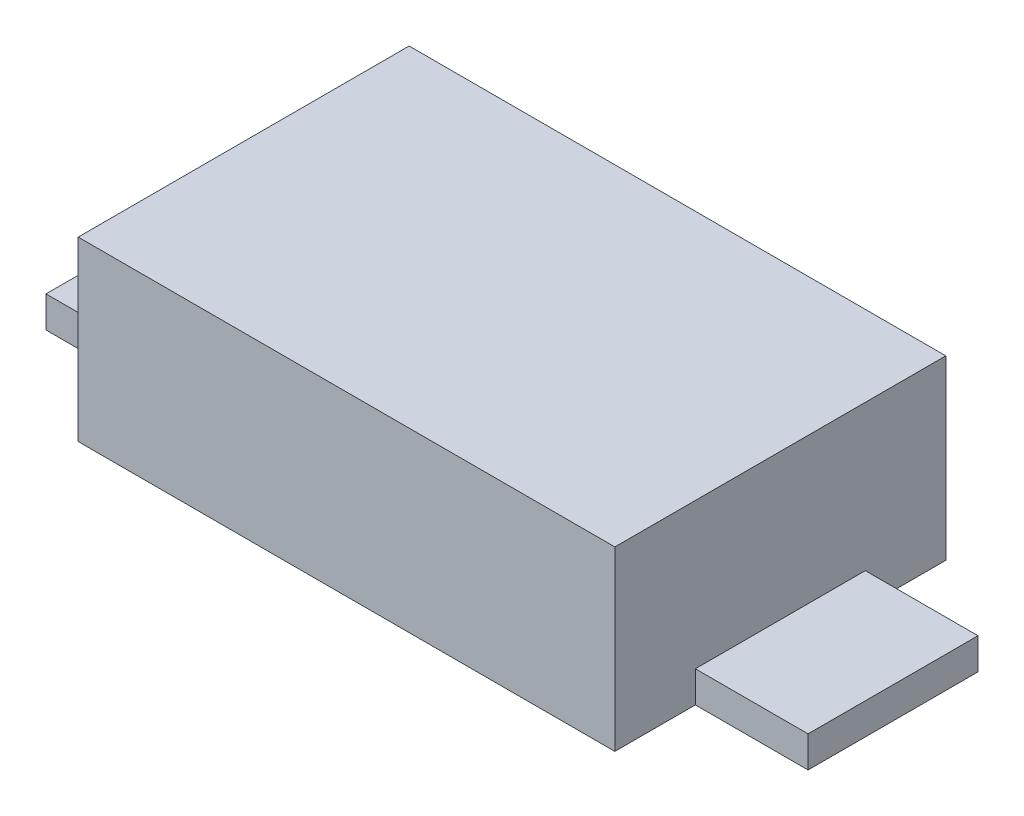
ISO-10303-21;
HEADER;
FILE_DESCRIPTION(('STEP AP214'),'2;1');
FILE_NAME('part.step','',(''),(''),'','','');
FILE_SCHEMA(('AUTOMOTIVE_DESIGN { 1 0 10303 214 1 1 1 1 }'));
ENDSEC;
DATA;
#1=APPLICATION_CONTEXT('core data for automotive mechanical design processes');
#2=APPLICATION_PROTOCOL_DEFINITION('international standard','automotive_design',2000,#1);
#3=PRODUCT_CONTEXT('',#1,'mechanical');
#4=PRODUCT('Part','Part','',(#3));
#5=PRODUCT_RELATED_PRODUCT_CATEGORY('part','',(#4));
#6=PRODUCT_DEFINITION_FORMATION('','',#4);
#7=PRODUCT_DEFINITION_CONTEXT('part definition',#1,'design');
#8=PRODUCT_DEFINITION('design','',#6,#7);
#9=PRODUCT_DEFINITION_SHAPE('','',#8);
#10=(LENGTH_UNIT() NAMED_UNIT(*) SI_UNIT(.MILLI.,.METRE.));
#11=(NAMED_UNIT(*) PLANE_ANGLE_UNIT() SI_UNIT($,.RADIAN.));
#12=(NAMED_UNIT(*) SI_UNIT($,.STERADIAN.) SOLID_ANGLE_UNIT());
#13=UNCERTAINTY_MEASURE_WITH_UNIT(LENGTH_MEASURE(1.E-05),#10,'distance_accuracy_value','');
#14=(GEOMETRIC_REPRESENTATION_CONTEXT(3) GLOBAL_UNCERTAINTY_ASSIGNED_CONTEXT((#13)) GLOBAL_UNIT_ASSIGNED_CONTEXT((#10,
#11,#12)) REPRESENTATION_CONTEXT('',''));
#15=CARTESIAN_POINT('',(0.,0.,0.));
#16=DIRECTION('',(0.,0.,1.));
#17=DIRECTION('',(1.,0.,0.));
#18=AXIS2_PLACEMENT_3D('',#15,#16,#17);
#19=CARTESIAN_POINT('',(-1.53260869565218,0.99,4.13260869565217));
#20=DIRECTION('',(-1.,0.,0.));
#21=DIRECTION('',(0.,0.,1.));
#22=AXIS2_PLACEMENT_3D('',#19,#20,#21);
#23=PLANE('',#22);
#24=DIRECTION('',(0.,-1.,0.));
#25=VECTOR('',#24,1.);
#26=CARTESIAN_POINT('',(-1.53260869565218,0.175,3.68260869565217));
#27=LINE('',#26,#25);
#28=CARTESIAN_POINT('',(-1.53260869565218,0.175,3.68260869565217));
#29=VERTEX_POINT('',#28);
#30=CARTESIAN_POINT('',(-1.53260869565218,0.,3.68260869565217));
#31=VERTEX_POINT('',#30);
#32=EDGE_CURVE('E130',#29,#31,#27,.T.);
#33=ORIENTED_EDGE('',*,*,#32,.F.);
#34=DIRECTION('',(0.,0.,1.));
#35=VECTOR('',#34,1.);
#36=CARTESIAN_POINT('',(-1.53260869565218,0.175,2.73260869565217));
#37=LINE('',#36,#35);
#38=CARTESIAN_POINT('',(-1.53260869565218,0.175,2.73260869565217));
#39=VERTEX_POINT('',#38);
#40=EDGE_CURVE('E137',#39,#29,#37,.T.);
#41=ORIENTED_EDGE('',*,*,#40,.F.);
#42=DIRECTION('',(0.,-1.,0.));
#43=VECTOR('',#42,1.);
#44=CARTESIAN_POINT('',(-1.53260869565218,0.175,2.73260869565217));
#45=LINE('',#44,#43);
#46=CARTESIAN_POINT('',(-1.53260869565218,0.,2.73260869565217));
#47=VERTEX_POINT('',#46);
#48=EDGE_CURVE('E219',#39,#47,#45,.T.);
#49=ORIENTED_EDGE('',*,*,#48,.T.);
#50=DIRECTION('',(0.,0.,-1.));
#51=VECTOR('',#50,1.);
#52=CARTESIAN_POINT('',(-1.53260869565218,0.,4.13260869565217));
#53=LINE('',#52,#51);
#54=CARTESIAN_POINT('',(-1.53260869565218,0.,2.28260869565217));
#55=VERTEX_POINT('',#54);
#56=EDGE_CURVE('E194',#47,#55,#53,.T.);
#57=ORIENTED_EDGE('',*,*,#56,.T.);
#58=DIRECTION('',(0.,-1.,0.));
#59=VECTOR('',#58,1.);
#60=CARTESIAN_POINT('',(-1.53260869565218,0.99,2.28260869565217));
#61=LINE('',#60,#59);
#62=CARTESIAN_POINT('',(-1.53260869565218,0.99,2.28260869565217));
#63=VERTEX_POINT('',#62);
#64=EDGE_CURVE('E199',#63,#55,#61,.T.);
#65=ORIENTED_EDGE('',*,*,#64,.F.);
#66=DIRECTION('',(0.,0.,-1.));
#67=VECTOR('',#66,1.);
#68=CARTESIAN_POINT('',(-1.53260869565218,0.99,4.13260869565217));
#69=LINE('',#68,#67);
#70=CARTESIAN_POINT('',(-1.53260869565218,0.99,4.13260869565217));
#71=VERTEX_POINT('',#70);
#72=EDGE_CURVE('E184',#71,#63,#69,.T.);
#73=ORIENTED_EDGE('',*,*,#72,.F.);
#74=DIRECTION('',(0.,-1.,0.));
#75=VECTOR('',#74,1.);
#76=CARTESIAN_POINT('',(-1.53260869565218,0.99,4.13260869565217));
#77=LINE('',#76,#75);
#78=CARTESIAN_POINT('',(-1.53260869565218,0.,4.13260869565217));
#79=VERTEX_POINT('',#78);
#80=EDGE_CURVE('E41',#71,#79,#77,.T.);
#81=ORIENTED_EDGE('',*,*,#80,.T.);
#82=EDGE_CURVE('E147',#79,#31,#53,.T.);
#83=ORIENTED_EDGE('',*,*,#82,.T.);
#84=EDGE_LOOP('',(#33,#41,#49,#57,#65,#73,#81,#83));
#85=FACE_BOUND('',#84,.T.);
#86=ADVANCED_FACE('F33',(#85),#23,.F.);
#87=CARTESIAN_POINT('',(-4.53260869565218,0.99,4.13260869565217));
#88=DIRECTION('',(1.,0.,0.));
#89=DIRECTION('',(0.,0.,-1.));
#90=AXIS2_PLACEMENT_3D('',#87,#88,#89);
#91=PLANE('',#90);
#92=DIRECTION('',(0.,-1.,0.));
#93=VECTOR('',#92,1.);
#94=CARTESIAN_POINT('',(-4.53260869565218,0.175,2.73260869565217));
#95=LINE('',#94,#93);
#96=CARTESIAN_POINT('',(-4.53260869565218,0.175,2.73260869565217));
#97=VERTEX_POINT('',#96);
#98=CARTESIAN_POINT('',(-4.53260869565218,0.,2.73260869565217));
#99=VERTEX_POINT('',#98);
#100=EDGE_CURVE('E174',#97,#99,#95,.T.);
#101=ORIENTED_EDGE('',*,*,#100,.F.);
#102=DIRECTION('',(0.,0.,-1.));
#103=VECTOR('',#102,1.);
#104=CARTESIAN_POINT('',(-4.53260869565218,0.175,2.73260869565217));
#105=LINE('',#104,#103);
#106=CARTESIAN_POINT('',(-4.53260869565218,0.175,3.68260869565217));
#107=VERTEX_POINT('',#106);
#108=EDGE_CURVE('E156',#107,#97,#105,.T.);
#109=ORIENTED_EDGE('',*,*,#108,.F.);
#110=DIRECTION('',(0.,-1.,0.));
#111=VECTOR('',#110,1.);
#112=CARTESIAN_POINT('',(-4.53260869565218,0.175,3.68260869565217));
#113=LINE('',#112,#111);
#114=CARTESIAN_POINT('',(-4.53260869565218,0.,3.68260869565217));
#115=VERTEX_POINT('',#114);
#116=EDGE_CURVE('E164',#107,#115,#113,.T.);
#117=ORIENTED_EDGE('',*,*,#116,.T.);
#118=DIRECTION('',(0.,0.,1.));
#119=VECTOR('',#118,1.);
#120=CARTESIAN_POINT('',(-4.53260869565218,0.,4.13260869565217));
#121=LINE('',#120,#119);
#122=CARTESIAN_POINT('',(-4.53260869565218,0.,4.13260869565217));
#123=VERTEX_POINT('',#122);
#124=EDGE_CURVE('E177',#115,#123,#121,.T.);
#125=ORIENTED_EDGE('',*,*,#124,.T.);
#126=DIRECTION('',(0.,-1.,0.));
#127=VECTOR('',#126,1.);
#128=CARTESIAN_POINT('',(-4.53260869565218,0.99,4.13260869565217));
#129=LINE('',#128,#127);
#130=CARTESIAN_POINT('',(-4.53260869565218,0.99,4.13260869565217));
#131=VERTEX_POINT('',#130);
#132=EDGE_CURVE('E11',#131,#123,#129,.T.);
#133=ORIENTED_EDGE('',*,*,#132,.F.);
#134=DIRECTION('',(0.,0.,1.));
#135=VECTOR('',#134,1.);
#136=CARTESIAN_POINT('',(-4.53260869565218,0.99,4.13260869565217));
#137=LINE('',#136,#135);
#138=CARTESIAN_POINT('',(-4.53260869565218,0.99,2.28260869565217));
#139=VERTEX_POINT('',#138);
#140=EDGE_CURVE('E178',#139,#131,#137,.T.);
#141=ORIENTED_EDGE('',*,*,#140,.F.);
#142=DIRECTION('',(0.,-1.,0.));
#143=VECTOR('',#142,1.);
#144=CARTESIAN_POINT('',(-4.53260869565218,0.99,2.28260869565217));
#145=LINE('',#144,#143);
#146=CARTESIAN_POINT('',(-4.53260869565218,0.,2.28260869565217));
#147=VERTEX_POINT('',#146);
#148=EDGE_CURVE('E188',#139,#147,#145,.T.);
#149=ORIENTED_EDGE('',*,*,#148,.T.);
#150=EDGE_CURVE('E189',#147,#99,#121,.T.);
#151=ORIENTED_EDGE('',*,*,#150,.T.);
#152=EDGE_LOOP('',(#101,#109,#117,#125,#133,#141,#149,#151));
#153=FACE_BOUND('',#152,.T.);
#154=ADVANCED_FACE('F35',(#153),#91,.F.);
#155=CARTESIAN_POINT('',(-4.53260869565218,0.99,4.13260869565217));
#156=DIRECTION('',(0.,0.,-1.));
#157=DIRECTION('',(-1.,0.,0.));
#158=AXIS2_PLACEMENT_3D('',#155,#156,#157);
#159=PLANE('',#158);
#160=DIRECTION('',(1.,0.,0.));
#161=VECTOR('',#160,1.);
#162=CARTESIAN_POINT('',(-4.53260869565218,0.,4.13260869565217));
#163=LINE('',#162,#161);
#164=EDGE_CURVE('E192',#123,#79,#163,.T.);
#165=ORIENTED_EDGE('',*,*,#164,.T.);
#166=ORIENTED_EDGE('',*,*,#80,.F.);
#167=DIRECTION('',(1.,0.,0.));
#168=VECTOR('',#167,1.);
#169=CARTESIAN_POINT('',(-4.53260869565218,0.99,4.13260869565217));
#170=LINE('',#169,#168);
#171=EDGE_CURVE('E181',#131,#71,#170,.T.);
#172=ORIENTED_EDGE('',*,*,#171,.F.);
#173=ORIENTED_EDGE('',*,*,#132,.T.);
#174=EDGE_LOOP('',(#165,#166,#172,#173));
#175=FACE_BOUND('',#174,.T.);
#176=ADVANCED_FACE('F233',(#175),#159,.F.);
#177=CARTESIAN_POINT('',(-4.53260869565218,0.99,2.28260869565217));
#178=DIRECTION('',(0.,0.,1.));
#179=DIRECTION('',(1.,0.,0.));
#180=AXIS2_PLACEMENT_3D('',#177,#178,#179);
#181=PLANE('',#180);
#182=DIRECTION('',(-1.,0.,0.));
#183=VECTOR('',#182,1.);
#184=CARTESIAN_POINT('',(-4.53260869565218,0.,2.28260869565217));
#185=LINE('',#184,#183);
#186=EDGE_CURVE('E182',#55,#147,#185,.T.);
#187=ORIENTED_EDGE('',*,*,#186,.T.);
#188=ORIENTED_EDGE('',*,*,#148,.F.);
#189=DIRECTION('',(-1.,0.,0.));
#190=VECTOR('',#189,1.);
#191=CARTESIAN_POINT('',(-4.53260869565218,0.99,2.28260869565217));
#192=LINE('',#191,#190);
#193=EDGE_CURVE('E186',#63,#139,#192,.T.);
#194=ORIENTED_EDGE('',*,*,#193,.F.);
#195=ORIENTED_EDGE('',*,*,#64,.T.);
#196=EDGE_LOOP('',(#187,#188,#194,#195));
#197=FACE_BOUND('',#196,.T.);
#198=ADVANCED_FACE('F227',(#197),#181,.F.);
#199=CARTESIAN_POINT('',(0.,0.99,0.));
#200=DIRECTION('',(0.,-1.,0.));
#201=DIRECTION('',(0.,0.,-1.));
#202=AXIS2_PLACEMENT_3D('',#199,#200,#201);
#203=PLANE('',#202);
#204=ORIENTED_EDGE('',*,*,#140,.T.);
#205=ORIENTED_EDGE('',*,*,#171,.T.);
#206=ORIENTED_EDGE('',*,*,#72,.T.);
#207=ORIENTED_EDGE('',*,*,#193,.T.);
#208=EDGE_LOOP('',(#204,#205,#206,#207));
#209=FACE_BOUND('',#208,.T.);
#210=ADVANCED_FACE('F231',(#209),#203,.F.);
#211=CARTESIAN_POINT('',(0.,0.,0.));
#212=DIRECTION('',(0.,-1.,0.));
#213=DIRECTION('',(0.,0.,-1.));
#214=AXIS2_PLACEMENT_3D('',#211,#212,#213);
#215=PLANE('',#214);
#216=ORIENTED_EDGE('',*,*,#150,.F.);
#217=ORIENTED_EDGE('',*,*,#186,.F.);
#218=ORIENTED_EDGE('',*,*,#56,.F.);
#219=DIRECTION('',(-1.,0.,0.));
#220=VECTOR('',#219,1.);
#221=CARTESIAN_POINT('',(-1.53260869565218,0.,2.73260869565217));
#222=LINE('',#221,#220);
#223=CARTESIAN_POINT('',(-0.902608695652176,0.,2.73260869565217));
#224=VERTEX_POINT('',#223);
#225=EDGE_CURVE('E48',#224,#47,#222,.T.);
#226=ORIENTED_EDGE('',*,*,#225,.F.);
#227=DIRECTION('',(0.,0.,-1.));
#228=VECTOR('',#227,1.);
#229=CARTESIAN_POINT('',(-0.902608695652176,0.,2.73260869565217));
#230=LINE('',#229,#228);
#231=CARTESIAN_POINT('',(-0.902608695652176,0.,3.68260869565217));
#232=VERTEX_POINT('',#231);
#233=EDGE_CURVE('E212',#232,#224,#230,.T.);
#234=ORIENTED_EDGE('',*,*,#233,.F.);
#235=DIRECTION('',(1.,0.,0.));
#236=VECTOR('',#235,1.);
#237=CARTESIAN_POINT('',(-1.53260869565218,0.,3.68260869565217));
#238=LINE('',#237,#236);
#239=EDGE_CURVE('E211',#31,#232,#238,.T.);
#240=ORIENTED_EDGE('',*,*,#239,.F.);
#241=ORIENTED_EDGE('',*,*,#82,.F.);
#242=ORIENTED_EDGE('',*,*,#164,.F.);
#243=ORIENTED_EDGE('',*,*,#124,.F.);
#244=DIRECTION('',(1.,0.,0.));
#245=VECTOR('',#244,1.);
#246=CARTESIAN_POINT('',(-4.53260869565218,0.,3.68260869565217));
#247=LINE('',#246,#245);
#248=CARTESIAN_POINT('',(-5.16260869565218,0.,3.68260869565217));
#249=VERTEX_POINT('',#248);
#250=EDGE_CURVE('E56',#249,#115,#247,.T.);
#251=ORIENTED_EDGE('',*,*,#250,.F.);
#252=DIRECTION('',(0.,0.,1.));
#253=VECTOR('',#252,1.);
#254=CARTESIAN_POINT('',(-5.16260869565218,0.,2.73260869565217));
#255=LINE('',#254,#253);
#256=CARTESIAN_POINT('',(-5.16260869565218,0.,2.73260869565217));
#257=VERTEX_POINT('',#256);
#258=EDGE_CURVE('E150',#257,#249,#255,.T.);
#259=ORIENTED_EDGE('',*,*,#258,.F.);
#260=DIRECTION('',(-1.,0.,0.));
#261=VECTOR('',#260,1.);
#262=CARTESIAN_POINT('',(-4.53260869565218,0.,2.73260869565217));
#263=LINE('',#262,#261);
#264=EDGE_CURVE('E148',#99,#257,#263,.T.);
#265=ORIENTED_EDGE('',*,*,#264,.F.);
#266=EDGE_LOOP('',(#216,#217,#218,#226,#234,#240,#241,#242,#243,#251,#259,#265));
#267=FACE_BOUND('',#266,.T.);
#268=ADVANCED_FACE('F208',(#267),#215,.T.);
#269=CARTESIAN_POINT('',(-4.53260869565218,0.175,2.73260869565217));
#270=DIRECTION('',(0.,0.,1.));
#271=DIRECTION('',(1.,0.,0.));
#272=AXIS2_PLACEMENT_3D('',#269,#270,#271);
#273=PLANE('',#272);
#274=ORIENTED_EDGE('',*,*,#264,.T.);
#275=DIRECTION('',(0.,-1.,0.));
#276=VECTOR('',#275,1.);
#277=CARTESIAN_POINT('',(-5.16260869565218,0.175,2.73260869565217));
#278=LINE('',#277,#276);
#279=CARTESIAN_POINT('',(-5.16260869565218,0.175,2.73260869565217));
#280=VERTEX_POINT('',#279);
#281=EDGE_CURVE('E171',#280,#257,#278,.T.);
#282=ORIENTED_EDGE('',*,*,#281,.F.);
#283=DIRECTION('',(-1.,0.,0.));
#284=VECTOR('',#283,1.);
#285=CARTESIAN_POINT('',(-4.53260869565218,0.175,2.73260869565217));
#286=LINE('',#285,#284);
#287=EDGE_CURVE('E159',#97,#280,#286,.T.);
#288=ORIENTED_EDGE('',*,*,#287,.F.);
#289=ORIENTED_EDGE('',*,*,#100,.T.);
#290=EDGE_LOOP('',(#274,#282,#288,#289));
#291=FACE_BOUND('',#290,.T.);
#292=ADVANCED_FACE('F248',(#291),#273,.F.);
#293=CARTESIAN_POINT('',(-5.16260869565218,0.175,2.73260869565217));
#294=DIRECTION('',(1.,0.,0.));
#295=DIRECTION('',(0.,0.,-1.));
#296=AXIS2_PLACEMENT_3D('',#293,#294,#295);
#297=PLANE('',#296);
#298=ORIENTED_EDGE('',*,*,#258,.T.);
#299=DIRECTION('',(0.,-1.,0.));
#300=VECTOR('',#299,1.);
#301=CARTESIAN_POINT('',(-5.16260869565218,0.175,3.68260869565217));
#302=LINE('',#301,#300);
#303=CARTESIAN_POINT('',(-5.16260869565218,0.175,3.68260869565217));
#304=VERTEX_POINT('',#303);
#305=EDGE_CURVE('E169',#304,#249,#302,.T.);
#306=ORIENTED_EDGE('',*,*,#305,.F.);
#307=DIRECTION('',(0.,0.,1.));
#308=VECTOR('',#307,1.);
#309=CARTESIAN_POINT('',(-5.16260869565218,0.175,2.73260869565217));
#310=LINE('',#309,#308);
#311=EDGE_CURVE('E161',#280,#304,#310,.T.);
#312=ORIENTED_EDGE('',*,*,#311,.F.);
#313=ORIENTED_EDGE('',*,*,#281,.T.);
#314=EDGE_LOOP('',(#298,#306,#312,#313));
#315=FACE_BOUND('',#314,.T.);
#316=ADVANCED_FACE('F240',(#315),#297,.F.);
#317=CARTESIAN_POINT('',(-4.53260869565218,0.175,3.68260869565217));
#318=DIRECTION('',(0.,0.,-1.));
#319=DIRECTION('',(-1.,0.,0.));
#320=AXIS2_PLACEMENT_3D('',#317,#318,#319);
#321=PLANE('',#320);
#322=ORIENTED_EDGE('',*,*,#250,.T.);
#323=ORIENTED_EDGE('',*,*,#116,.F.);
#324=DIRECTION('',(1.,0.,0.));
#325=VECTOR('',#324,1.);
#326=CARTESIAN_POINT('',(-4.53260869565218,0.175,3.68260869565217));
#327=LINE('',#326,#325);
#328=EDGE_CURVE('E163',#304,#107,#327,.T.);
#329=ORIENTED_EDGE('',*,*,#328,.F.);
#330=ORIENTED_EDGE('',*,*,#305,.T.);
#331=EDGE_LOOP('',(#322,#323,#329,#330));
#332=FACE_BOUND('',#331,.T.);
#333=ADVANCED_FACE('F244',(#332),#321,.F.);
#334=CARTESIAN_POINT('',(0.,0.175,0.));
#335=DIRECTION('',(0.,-1.,0.));
#336=DIRECTION('',(0.,0.,-1.));
#337=AXIS2_PLACEMENT_3D('',#334,#335,#336);
#338=PLANE('',#337);
#339=ORIENTED_EDGE('',*,*,#108,.T.);
#340=ORIENTED_EDGE('',*,*,#287,.T.);
#341=ORIENTED_EDGE('',*,*,#311,.T.);
#342=ORIENTED_EDGE('',*,*,#328,.T.);
#343=EDGE_LOOP('',(#339,#340,#341,#342));
#344=FACE_BOUND('',#343,.T.);
#345=ADVANCED_FACE('F246',(#344),#338,.F.);
#346=CARTESIAN_POINT('',(-1.53260869565218,0.175,3.68260869565217));
#347=DIRECTION('',(0.,0.,-1.));
#348=DIRECTION('',(-1.,0.,0.));
#349=AXIS2_PLACEMENT_3D('',#346,#347,#348);
#350=PLANE('',#349);
#351=ORIENTED_EDGE('',*,*,#239,.T.);
#352=DIRECTION('',(0.,-1.,0.));
#353=VECTOR('',#352,1.);
#354=CARTESIAN_POINT('',(-0.902608695652176,0.175,3.68260869565217));
#355=LINE('',#354,#353);
#356=CARTESIAN_POINT('',(-0.902608695652176,0.175,3.68260869565217));
#357=VERTEX_POINT('',#356);
#358=EDGE_CURVE('E133',#357,#232,#355,.T.);
#359=ORIENTED_EDGE('',*,*,#358,.F.);
#360=DIRECTION('',(1.,0.,0.));
#361=VECTOR('',#360,1.);
#362=CARTESIAN_POINT('',(-1.53260869565218,0.175,3.68260869565217));
#363=LINE('',#362,#361);
#364=EDGE_CURVE('E126',#29,#357,#363,.T.);
#365=ORIENTED_EDGE('',*,*,#364,.F.);
#366=ORIENTED_EDGE('',*,*,#32,.T.);
#367=EDGE_LOOP('',(#351,#359,#365,#366));
#368=FACE_BOUND('',#367,.T.);
#369=ADVANCED_FACE('F128',(#368),#350,.F.);
#370=CARTESIAN_POINT('',(-0.902608695652176,0.175,2.73260869565217));
#371=DIRECTION('',(-1.,0.,0.));
#372=DIRECTION('',(0.,0.,1.));
#373=AXIS2_PLACEMENT_3D('',#370,#371,#372);
#374=PLANE('',#373);
#375=ORIENTED_EDGE('',*,*,#233,.T.);
#376=DIRECTION('',(0.,-1.,0.));
#377=VECTOR('',#376,1.);
#378=CARTESIAN_POINT('',(-0.902608695652176,0.175,2.73260869565217));
#379=LINE('',#378,#377);
#380=CARTESIAN_POINT('',(-0.902608695652176,0.175,2.73260869565217));
#381=VERTEX_POINT('',#380);
#382=EDGE_CURVE('E152',#381,#224,#379,.T.);
#383=ORIENTED_EDGE('',*,*,#382,.F.);
#384=DIRECTION('',(0.,0.,-1.));
#385=VECTOR('',#384,1.);
#386=CARTESIAN_POINT('',(-0.902608695652176,0.175,2.73260869565217));
#387=LINE('',#386,#385);
#388=EDGE_CURVE('E136',#357,#381,#387,.T.);
#389=ORIENTED_EDGE('',*,*,#388,.F.);
#390=ORIENTED_EDGE('',*,*,#358,.T.);
#391=EDGE_LOOP('',(#375,#383,#389,#390));
#392=FACE_BOUND('',#391,.T.);
#393=ADVANCED_FACE('F316',(#392),#374,.F.);
#394=CARTESIAN_POINT('',(-1.53260869565218,0.175,2.73260869565217));
#395=DIRECTION('',(0.,0.,1.));
#396=DIRECTION('',(1.,0.,0.));
#397=AXIS2_PLACEMENT_3D('',#394,#395,#396);
#398=PLANE('',#397);
#399=ORIENTED_EDGE('',*,*,#225,.T.);
#400=ORIENTED_EDGE('',*,*,#48,.F.);
#401=DIRECTION('',(-1.,0.,0.));
#402=VECTOR('',#401,1.);
#403=CARTESIAN_POINT('',(-1.53260869565218,0.175,2.73260869565217));
#404=LINE('',#403,#402);
#405=EDGE_CURVE('E142',#381,#39,#404,.T.);
#406=ORIENTED_EDGE('',*,*,#405,.F.);
#407=ORIENTED_EDGE('',*,*,#382,.T.);
#408=EDGE_LOOP('',(#399,#400,#406,#407));
#409=FACE_BOUND('',#408,.T.);
#410=ADVANCED_FACE('F221',(#409),#398,.F.);
#411=CARTESIAN_POINT('',(0.,0.175,0.));
#412=DIRECTION('',(0.,1.,0.));
#413=DIRECTION('',(0.,0.,1.));
#414=AXIS2_PLACEMENT_3D('',#411,#412,#413);
#415=PLANE('',#414);
#416=ORIENTED_EDGE('',*,*,#40,.T.);
#417=ORIENTED_EDGE('',*,*,#364,.T.);
#418=ORIENTED_EDGE('',*,*,#388,.T.);
#419=ORIENTED_EDGE('',*,*,#405,.T.);
#420=EDGE_LOOP('',(#416,#417,#418,#419));
#421=FACE_BOUND('',#420,.T.);
#422=ADVANCED_FACE('F140',(#421),#415,.T.);
#423=CLOSED_SHELL('',(#86,#154,#176,#198,#210,#268,#292,#316,#333,#345,#369,#393,#410,#422));
#424=MANIFOLD_SOLID_BREP('B2',#423);
#425=ADVANCED_BREP_SHAPE_REPRESENTATION('',(#18,#424),#14);
#426=SHAPE_DEFINITION_REPRESENTATION(#9,#425);
ENDSEC;
END-ISO-10303-21;
